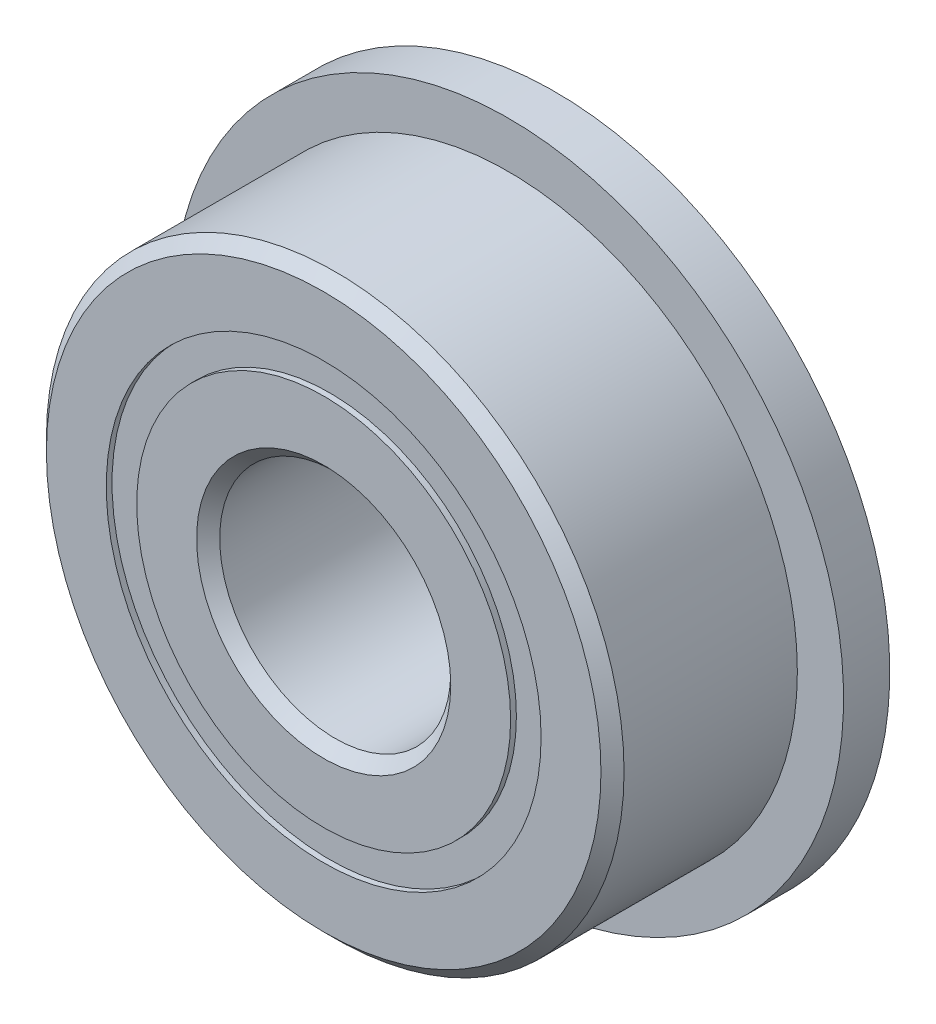
ISO-10303-21;
HEADER;
FILE_DESCRIPTION(('STEP AP214'),'2;1');
FILE_NAME('part.step','',(''),(''),'','','');
FILE_SCHEMA(('AUTOMOTIVE_DESIGN { 1 0 10303 214 1 1 1 1 }'));
ENDSEC;
DATA;
#1=APPLICATION_CONTEXT('core data for automotive mechanical design processes');
#2=APPLICATION_PROTOCOL_DEFINITION('international standard','automotive_design',2000,#1);
#3=PRODUCT_CONTEXT('',#1,'mechanical');
#4=PRODUCT('Part','Part','',(#3));
#5=PRODUCT_RELATED_PRODUCT_CATEGORY('part','',(#4));
#6=PRODUCT_DEFINITION_FORMATION('','',#4);
#7=PRODUCT_DEFINITION_CONTEXT('part definition',#1,'design');
#8=PRODUCT_DEFINITION('design','',#6,#7);
#9=PRODUCT_DEFINITION_SHAPE('','',#8);
#10=(LENGTH_UNIT() NAMED_UNIT(*) SI_UNIT(.MILLI.,.METRE.));
#11=(NAMED_UNIT(*) PLANE_ANGLE_UNIT() SI_UNIT($,.RADIAN.));
#12=(NAMED_UNIT(*) SI_UNIT($,.STERADIAN.) SOLID_ANGLE_UNIT());
#13=UNCERTAINTY_MEASURE_WITH_UNIT(LENGTH_MEASURE(1.E-05),#10,'distance_accuracy_value','');
#14=(GEOMETRIC_REPRESENTATION_CONTEXT(3) GLOBAL_UNCERTAINTY_ASSIGNED_CONTEXT((#13)) GLOBAL_UNIT_ASSIGNED_CONTEXT((#10,
#11,#12)) REPRESENTATION_CONTEXT('',''));
#15=CARTESIAN_POINT('',(0.,0.,0.));
#16=DIRECTION('',(0.,0.,1.));
#17=DIRECTION('',(1.,0.,0.));
#18=AXIS2_PLACEMENT_3D('',#15,#16,#17);
#19=CARTESIAN_POINT('',(0.,3.76373626373626,-1.9));
#20=DIRECTION('',(0.,0.,1.));
#21=DIRECTION('',(1.,0.,0.));
#22=AXIS2_PLACEMENT_3D('',#19,#20,#21);
#23=PLANE('',#22);
#24=CARTESIAN_POINT('',(0.,0.,-1.9));
#25=DIRECTION('',(0.,0.,1.));
#26=DIRECTION('',(1.,0.,0.));
#27=AXIS2_PLACEMENT_3D('',#24,#25,#26);
#28=CIRCLE('',#27,3.76373626373626);
#29=CARTESIAN_POINT('',(3.76373626373626,0.,-1.9));
#30=VERTEX_POINT('',#29);
#31=EDGE_CURVE('E65',#30,#30,#28,.T.);
#32=ORIENTED_EDGE('',*,*,#31,.F.);
#33=EDGE_LOOP('',(#32));
#34=FACE_BOUND('',#33,.T.);
#35=CARTESIAN_POINT('',(0.,0.,-1.9));
#36=DIRECTION('',(0.,0.,1.));
#37=DIRECTION('',(1.,0.,0.));
#38=AXIS2_PLACEMENT_3D('',#35,#36,#37);
#39=CIRCLE('',#38,3.23626373626373);
#40=CARTESIAN_POINT('',(3.23626373626373,0.,-1.9));
#41=VERTEX_POINT('',#40);
#42=EDGE_CURVE('E13',#41,#41,#39,.T.);
#43=ORIENTED_EDGE('',*,*,#42,.T.);
#44=EDGE_LOOP('',(#43));
#45=FACE_BOUND('',#44,.T.);
#46=ADVANCED_FACE('F51',(#34,#45),#23,.F.);
#47=CARTESIAN_POINT('',(0.,0.,2.));
#48=DIRECTION('',(0.,0.,1.));
#49=DIRECTION('',(1.,0.,0.));
#50=AXIS2_PLACEMENT_3D('',#47,#48,#49);
#51=CYLINDRICAL_SURFACE('',#50,3.23626373626374);
#52=ORIENTED_EDGE('',*,*,#42,.F.);
#53=EDGE_LOOP('',(#52));
#54=FACE_BOUND('',#53,.T.);
#55=CARTESIAN_POINT('',(0.,0.,-0.927189448602436));
#56=DIRECTION('',(0.,0.,1.));
#57=DIRECTION('',(1.,0.,0.));
#58=AXIS2_PLACEMENT_3D('',#55,#56,#57);
#59=CIRCLE('',#58,3.23626373626374);
#60=CARTESIAN_POINT('',(3.23626373626374,0.,-0.927189448602436));
#61=VERTEX_POINT('',#60);
#62=EDGE_CURVE('E57',#61,#61,#59,.T.);
#63=ORIENTED_EDGE('',*,*,#62,.T.);
#64=EDGE_LOOP('',(#63));
#65=FACE_BOUND('',#64,.T.);
#66=ADVANCED_FACE('F74',(#54,#65),#51,.F.);
#67=CARTESIAN_POINT('',(0.,3.76373626373626,-0.927189448602435));
#68=DIRECTION('',(0.,0.,-1.));
#69=DIRECTION('',(-1.,0.,0.));
#70=AXIS2_PLACEMENT_3D('',#67,#68,#69);
#71=PLANE('',#70);
#72=ORIENTED_EDGE('',*,*,#62,.F.);
#73=EDGE_LOOP('',(#72));
#74=FACE_BOUND('',#73,.T.);
#75=CARTESIAN_POINT('',(0.,0.,-0.927189448602436));
#76=DIRECTION('',(0.,0.,1.));
#77=DIRECTION('',(1.,0.,0.));
#78=AXIS2_PLACEMENT_3D('',#75,#76,#77);
#79=CIRCLE('',#78,3.76373626373626);
#80=CARTESIAN_POINT('',(3.76373626373626,0.,-0.927189448602436));
#81=VERTEX_POINT('',#80);
#82=EDGE_CURVE('E61',#81,#81,#79,.T.);
#83=ORIENTED_EDGE('',*,*,#82,.T.);
#84=EDGE_LOOP('',(#83));
#85=FACE_BOUND('',#84,.T.);
#86=ADVANCED_FACE('F78',(#74,#85),#71,.F.);
#87=CARTESIAN_POINT('',(0.,0.,2.));
#88=DIRECTION('',(0.,0.,1.));
#89=DIRECTION('',(1.,0.,0.));
#90=AXIS2_PLACEMENT_3D('',#87,#88,#89);
#91=CYLINDRICAL_SURFACE('',#90,3.76373626373626);
#92=ORIENTED_EDGE('',*,*,#82,.F.);
#93=EDGE_LOOP('',(#92));
#94=FACE_BOUND('',#93,.T.);
#95=ORIENTED_EDGE('',*,*,#31,.T.);
#96=EDGE_LOOP('',(#95));
#97=FACE_BOUND('',#96,.T.);
#98=ADVANCED_FACE('F71',(#94,#97),#91,.T.);
#99=CLOSED_SHELL('',(#46,#66,#86,#98));
#100=MANIFOLD_SOLID_BREP('B2',#99);
#101=CARTESIAN_POINT('',(0.,3.76373626373626,1.9));
#102=DIRECTION('',(0.,0.,-1.));
#103=DIRECTION('',(-1.,0.,0.));
#104=AXIS2_PLACEMENT_3D('',#101,#102,#103);
#105=PLANE('',#104);
#106=CARTESIAN_POINT('',(0.,0.,1.9));
#107=DIRECTION('',(0.,0.,1.));
#108=DIRECTION('',(1.,0.,0.));
#109=AXIS2_PLACEMENT_3D('',#106,#107,#108);
#110=CIRCLE('',#109,3.23626373626374);
#111=CARTESIAN_POINT('',(3.23626373626374,0.,1.9));
#112=VERTEX_POINT('',#111);
#113=EDGE_CURVE('E50',#112,#112,#110,.T.);
#114=ORIENTED_EDGE('',*,*,#113,.F.);
#115=EDGE_LOOP('',(#114));
#116=FACE_BOUND('',#115,.T.);
#117=CARTESIAN_POINT('',(0.,0.,1.9));
#118=DIRECTION('',(0.,0.,1.));
#119=DIRECTION('',(1.,0.,0.));
#120=AXIS2_PLACEMENT_3D('',#117,#118,#119);
#121=CIRCLE('',#120,3.76373626373626);
#122=CARTESIAN_POINT('',(3.76373626373626,0.,1.9));
#123=VERTEX_POINT('',#122);
#124=EDGE_CURVE('E139',#123,#123,#121,.T.);
#125=ORIENTED_EDGE('',*,*,#124,.T.);
#126=EDGE_LOOP('',(#125));
#127=FACE_BOUND('',#126,.T.);
#128=ADVANCED_FACE('F125',(#116,#127),#105,.F.);
#129=CARTESIAN_POINT('',(0.,0.,2.));
#130=DIRECTION('',(0.,0.,1.));
#131=DIRECTION('',(1.,0.,0.));
#132=AXIS2_PLACEMENT_3D('',#129,#130,#131);
#133=CYLINDRICAL_SURFACE('',#132,3.23626373626374);
#134=CARTESIAN_POINT('',(0.,0.,0.927189448602434));
#135=DIRECTION('',(0.,0.,1.));
#136=DIRECTION('',(1.,0.,0.));
#137=AXIS2_PLACEMENT_3D('',#134,#135,#136);
#138=CIRCLE('',#137,3.23626373626374);
#139=CARTESIAN_POINT('',(3.23626373626374,0.,0.927189448602434));
#140=VERTEX_POINT('',#139);
#141=EDGE_CURVE('E131',#140,#140,#138,.T.);
#142=ORIENTED_EDGE('',*,*,#141,.F.);
#143=EDGE_LOOP('',(#142));
#144=FACE_BOUND('',#143,.T.);
#145=ORIENTED_EDGE('',*,*,#113,.T.);
#146=EDGE_LOOP('',(#145));
#147=FACE_BOUND('',#146,.T.);
#148=ADVANCED_FACE('F154',(#144,#147),#133,.F.);
#149=CARTESIAN_POINT('',(0.,3.76373626373626,0.927189448602434));
#150=DIRECTION('',(0.,0.,1.));
#151=DIRECTION('',(1.,0.,0.));
#152=AXIS2_PLACEMENT_3D('',#149,#150,#151);
#153=PLANE('',#152);
#154=CARTESIAN_POINT('',(0.,0.,0.927189448602434));
#155=DIRECTION('',(0.,0.,1.));
#156=DIRECTION('',(1.,0.,0.));
#157=AXIS2_PLACEMENT_3D('',#154,#155,#156);
#158=CIRCLE('',#157,3.76373626373626);
#159=CARTESIAN_POINT('',(3.76373626373626,0.,0.927189448602434));
#160=VERTEX_POINT('',#159);
#161=EDGE_CURVE('E135',#160,#160,#158,.T.);
#162=ORIENTED_EDGE('',*,*,#161,.F.);
#163=EDGE_LOOP('',(#162));
#164=FACE_BOUND('',#163,.T.);
#165=ORIENTED_EDGE('',*,*,#141,.T.);
#166=EDGE_LOOP('',(#165));
#167=FACE_BOUND('',#166,.T.);
#168=ADVANCED_FACE('F149',(#164,#167),#153,.F.);
#169=CARTESIAN_POINT('',(0.,0.,2.));
#170=DIRECTION('',(0.,0.,1.));
#171=DIRECTION('',(1.,0.,0.));
#172=AXIS2_PLACEMENT_3D('',#169,#170,#171);
#173=CYLINDRICAL_SURFACE('',#172,3.76373626373626);
#174=ORIENTED_EDGE('',*,*,#124,.F.);
#175=EDGE_LOOP('',(#174));
#176=FACE_BOUND('',#175,.T.);
#177=ORIENTED_EDGE('',*,*,#161,.T.);
#178=EDGE_LOOP('',(#177));
#179=FACE_BOUND('',#178,.T.);
#180=ADVANCED_FACE('F146',(#176,#179),#173,.T.);
#181=CLOSED_SHELL('',(#128,#148,#168,#180));
#182=MANIFOLD_SOLID_BREP('B8',#181);
#183=CARTESIAN_POINT('',(-1.74999999999996,3.03108891324556,0.));
#184=DIRECTION('',(0.,0.,1.));
#185=DIRECTION('',(-0.499999999999989,0.866025403784445,0.));
#186=AXIS2_PLACEMENT_3D('',#183,#184,#185);
#187=SPHERICAL_SURFACE('',#186,0.927189448602435);
#188=CARTESIAN_POINT('',(-1.74999999999996,3.03108891324556,0.927189448602434));
#189=VERTEX_POINT('',#188);
#190=VERTEX_LOOP('',#189);
#191=FACE_BOUND('',#190,.T.);
#192=ADVANCED_FACE('F196',(#191),#187,.T.);
#193=CLOSED_SHELL('',(#192));
#194=MANIFOLD_SOLID_BREP('B45',#193);
#195=CARTESIAN_POINT('',(-3.03108891324552,1.75000000000004,0.));
#196=DIRECTION('',(0.,0.,1.));
#197=DIRECTION('',(-0.866025403784433,0.50000000000001,0.));
#198=AXIS2_PLACEMENT_3D('',#195,#196,#197);
#199=SPHERICAL_SURFACE('',#198,0.927189448602435);
#200=CARTESIAN_POINT('',(-3.03108891324552,1.75000000000004,0.927189448602434));
#201=VERTEX_POINT('',#200);
#202=VERTEX_LOOP('',#201);
#203=FACE_BOUND('',#202,.T.);
#204=ADVANCED_FACE('F218',(#203),#199,.T.);
#205=CLOSED_SHELL('',(#204));
#206=MANIFOLD_SOLID_BREP('B121',#205);
#207=CARTESIAN_POINT('',(-3.5,0.,0.));
#208=DIRECTION('',(0.,0.,1.));
#209=DIRECTION('',(-1.,0.,0.));
#210=AXIS2_PLACEMENT_3D('',#207,#208,#209);
#211=SPHERICAL_SURFACE('',#210,0.927189448602435);
#212=CARTESIAN_POINT('',(-3.5,0.,0.927189448602434));
#213=VERTEX_POINT('',#212);
#214=VERTEX_LOOP('',#213);
#215=FACE_BOUND('',#214,.T.);
#216=ADVANCED_FACE('F240',(#215),#211,.T.);
#217=CLOSED_SHELL('',(#216));
#218=MANIFOLD_SOLID_BREP('B192',#217);
#219=CARTESIAN_POINT('',(-3.03108891324555,-1.74999999999997,0.));
#220=DIRECTION('',(0.,0.,1.));
#221=DIRECTION('',(-0.866025403784443,-0.499999999999992,0.));
#222=AXIS2_PLACEMENT_3D('',#219,#220,#221);
#223=SPHERICAL_SURFACE('',#222,0.927189448602435);
#224=CARTESIAN_POINT('',(-3.03108891324555,-1.74999999999997,0.927189448602434));
#225=VERTEX_POINT('',#224);
#226=VERTEX_LOOP('',#225);
#227=FACE_BOUND('',#226,.T.);
#228=ADVANCED_FACE('F262',(#227),#223,.T.);
#229=CLOSED_SHELL('',(#228));
#230=MANIFOLD_SOLID_BREP('B214',#229);
#231=CARTESIAN_POINT('',(-1.75000000000003,-3.03108891324552,0.));
#232=DIRECTION('',(0.,0.,1.));
#233=DIRECTION('',(-0.500000000000007,-0.866025403784435,0.));
#234=AXIS2_PLACEMENT_3D('',#231,#232,#233);
#235=SPHERICAL_SURFACE('',#234,0.927189448602435);
#236=CARTESIAN_POINT('',(-1.75000000000003,-3.03108891324552,0.927189448602434));
#237=VERTEX_POINT('',#236);
#238=VERTEX_LOOP('',#237);
#239=FACE_BOUND('',#238,.T.);
#240=ADVANCED_FACE('F283',(#239),#235,.T.);
#241=CLOSED_SHELL('',(#240));
#242=MANIFOLD_SOLID_BREP('B236',#241);
#243=CARTESIAN_POINT('',(0.,-3.5,0.));
#244=DIRECTION('',(0.,0.,1.));
#245=DIRECTION('',(0.,-1.,0.));
#246=AXIS2_PLACEMENT_3D('',#243,#244,#245);
#247=SPHERICAL_SURFACE('',#246,0.927189448602435);
#248=CARTESIAN_POINT('',(0.,-3.5,0.927189448602434));
#249=VERTEX_POINT('',#248);
#250=VERTEX_LOOP('',#249);
#251=FACE_BOUND('',#250,.T.);
#252=ADVANCED_FACE('F302',(#251),#247,.T.);
#253=CLOSED_SHELL('',(#252));
#254=MANIFOLD_SOLID_BREP('B258',#253);
#255=CARTESIAN_POINT('',(1.74999999999998,-3.03108891324555,0.));
#256=DIRECTION('',(0.,0.,1.));
#257=DIRECTION('',(0.499999999999995,-0.866025403784442,0.));
#258=AXIS2_PLACEMENT_3D('',#255,#256,#257);
#259=SPHERICAL_SURFACE('',#258,0.927189448602435);
#260=CARTESIAN_POINT('',(1.74999999999998,-3.03108891324555,0.927189448602434));
#261=VERTEX_POINT('',#260);
#262=VERTEX_LOOP('',#261);
#263=FACE_BOUND('',#262,.T.);
#264=ADVANCED_FACE('F324',(#263),#259,.T.);
#265=CLOSED_SHELL('',(#264));
#266=MANIFOLD_SOLID_BREP('B279',#265);
#267=CARTESIAN_POINT('',(3.03108891324553,-1.75000000000001,0.));
#268=DIRECTION('',(0.,0.,1.));
#269=DIRECTION('',(0.866025403784436,-0.500000000000004,0.));
#270=AXIS2_PLACEMENT_3D('',#267,#268,#269);
#271=SPHERICAL_SURFACE('',#270,0.927189448602435);
#272=CARTESIAN_POINT('',(3.03108891324553,-1.75000000000001,0.927189448602434));
#273=VERTEX_POINT('',#272);
#274=VERTEX_LOOP('',#273);
#275=FACE_BOUND('',#274,.T.);
#276=ADVANCED_FACE('F346',(#275),#271,.T.);
#277=CLOSED_SHELL('',(#276));
#278=MANIFOLD_SOLID_BREP('B298',#277);
#279=CARTESIAN_POINT('',(3.5,0.,0.));
#280=DIRECTION('',(0.,0.,1.));
#281=DIRECTION('',(1.,0.,0.));
#282=AXIS2_PLACEMENT_3D('',#279,#280,#281);
#283=SPHERICAL_SURFACE('',#282,0.927189448602435);
#284=CARTESIAN_POINT('',(3.5,0.,0.927189448602434));
#285=VERTEX_POINT('',#284);
#286=VERTEX_LOOP('',#285);
#287=FACE_BOUND('',#286,.T.);
#288=ADVANCED_FACE('F368',(#287),#283,.T.);
#289=CLOSED_SHELL('',(#288));
#290=MANIFOLD_SOLID_BREP('B320',#289);
#291=CARTESIAN_POINT('',(3.03108891324554,1.74999999999999,0.));
#292=DIRECTION('',(0.,0.,1.));
#293=DIRECTION('',(0.86602540378444,0.499999999999998,0.));
#294=AXIS2_PLACEMENT_3D('',#291,#292,#293);
#295=SPHERICAL_SURFACE('',#294,0.927189448602435);
#296=CARTESIAN_POINT('',(3.03108891324554,1.74999999999999,0.927189448602434));
#297=VERTEX_POINT('',#296);
#298=VERTEX_LOOP('',#297);
#299=FACE_BOUND('',#298,.T.);
#300=ADVANCED_FACE('F390',(#299),#295,.T.);
#301=CLOSED_SHELL('',(#300));
#302=MANIFOLD_SOLID_BREP('B342',#301);
#303=CARTESIAN_POINT('',(1.75,3.03108891324553,0.));
#304=DIRECTION('',(0.,0.,1.));
#305=DIRECTION('',(0.500000000000001,0.866025403784438,0.));
#306=AXIS2_PLACEMENT_3D('',#303,#304,#305);
#307=SPHERICAL_SURFACE('',#306,0.927189448602435);
#308=CARTESIAN_POINT('',(1.75,3.03108891324553,0.927189448602434));
#309=VERTEX_POINT('',#308);
#310=VERTEX_LOOP('',#309);
#311=FACE_BOUND('',#310,.T.);
#312=ADVANCED_FACE('F411',(#311),#307,.T.);
#313=CLOSED_SHELL('',(#312));
#314=MANIFOLD_SOLID_BREP('B364',#313);
#315=CARTESIAN_POINT('',(0.,3.5,0.));
#316=DIRECTION('',(0.,0.,1.));
#317=DIRECTION('',(0.,1.,0.));
#318=AXIS2_PLACEMENT_3D('',#315,#316,#317);
#319=SPHERICAL_SURFACE('',#318,0.927189448602435);
#320=CARTESIAN_POINT('',(0.,3.5,0.927189448602434));
#321=VERTEX_POINT('',#320);
#322=VERTEX_LOOP('',#321);
#323=FACE_BOUND('',#322,.T.);
#324=ADVANCED_FACE('F433',(#323),#319,.T.);
#325=CLOSED_SHELL('',(#324));
#326=MANIFOLD_SOLID_BREP('B386',#325);
#327=CARTESIAN_POINT('',(0.,3.23626373626374,2.));
#328=DIRECTION('',(0.,0.,-1.));
#329=DIRECTION('',(-1.,0.,0.));
#330=AXIS2_PLACEMENT_3D('',#327,#328,#329);
#331=PLANE('',#330);
#332=CARTESIAN_POINT('',(0.,0.,2.));
#333=DIRECTION('',(0.,0.,1.));
#334=DIRECTION('',(1.,0.,0.));
#335=AXIS2_PLACEMENT_3D('',#332,#333,#334);
#336=CIRCLE('',#335,2.2);
#337=CARTESIAN_POINT('',(2.2,0.,2.));
#338=VERTEX_POINT('',#337);
#339=EDGE_CURVE('E488',#338,#338,#336,.T.);
#340=ORIENTED_EDGE('',*,*,#339,.F.);
#341=EDGE_LOOP('',(#340));
#342=FACE_BOUND('',#341,.T.);
#343=CARTESIAN_POINT('',(0.,0.,2.));
#344=DIRECTION('',(0.,0.,1.));
#345=DIRECTION('',(1.,0.,0.));
#346=AXIS2_PLACEMENT_3D('',#343,#344,#345);
#347=CIRCLE('',#346,3.23626373626374);
#348=CARTESIAN_POINT('',(3.23626373626374,0.,2.));
#349=VERTEX_POINT('',#348);
#350=EDGE_CURVE('E432',#349,#349,#347,.T.);
#351=ORIENTED_EDGE('',*,*,#350,.T.);
#352=EDGE_LOOP('',(#351));
#353=FACE_BOUND('',#352,.T.);
#354=ADVANCED_FACE('F460',(#342,#353),#331,.F.);
#355=CARTESIAN_POINT('',(0.,0.,2.));
#356=DIRECTION('',(0.,0.,1.));
#357=DIRECTION('',(1.,0.,0.));
#358=AXIS2_PLACEMENT_3D('',#355,#356,#357);
#359=CYLINDRICAL_SURFACE('',#358,3.23626373626374);
#360=ORIENTED_EDGE('',*,*,#350,.F.);
#361=EDGE_LOOP('',(#360));
#362=FACE_BOUND('',#361,.T.);
#363=CARTESIAN_POINT('',(0.,0.,0.888888888888888));
#364=DIRECTION('',(0.,0.,1.));
#365=DIRECTION('',(1.,0.,0.));
#366=AXIS2_PLACEMENT_3D('',#363,#364,#365);
#367=CIRCLE('',#366,3.23626373626374);
#368=CARTESIAN_POINT('',(3.23626373626374,0.,0.888888888888888));
#369=VERTEX_POINT('',#368);
#370=EDGE_CURVE('E466',#369,#369,#367,.T.);
#371=ORIENTED_EDGE('',*,*,#370,.T.);
#372=EDGE_LOOP('',(#371));
#373=FACE_BOUND('',#372,.T.);
#374=ADVANCED_FACE('F495',(#362,#373),#359,.T.);
#375=CARTESIAN_POINT('',(0.,0.,0.));
#376=DIRECTION('',(0.,0.,1.));
#377=DIRECTION('',(1.,0.,0.));
#378=AXIS2_PLACEMENT_3D('',#375,#376,#377);
#379=TOROIDAL_SURFACE('',#378,3.49999999999999,0.927189448602433);
#380=ORIENTED_EDGE('',*,*,#370,.F.);
#381=EDGE_LOOP('',(#380));
#382=FACE_BOUND('',#381,.T.);
#383=CARTESIAN_POINT('',(0.,0.,-0.88888888888889));
#384=DIRECTION('',(0.,0.,1.));
#385=DIRECTION('',(1.,0.,0.));
#386=AXIS2_PLACEMENT_3D('',#383,#384,#385);
#387=CIRCLE('',#386,3.23626373626373);
#388=CARTESIAN_POINT('',(3.23626373626373,0.,-0.88888888888889));
#389=VERTEX_POINT('',#388);
#390=EDGE_CURVE('E470',#389,#389,#387,.T.);
#391=ORIENTED_EDGE('',*,*,#390,.T.);
#392=EDGE_LOOP('',(#391));
#393=FACE_BOUND('',#392,.T.);
#394=ADVANCED_FACE('F499',(#382,#393),#379,.F.);
#395=CARTESIAN_POINT('',(0.,0.,2.));
#396=DIRECTION('',(0.,0.,1.));
#397=DIRECTION('',(1.,0.,0.));
#398=AXIS2_PLACEMENT_3D('',#395,#396,#397);
#399=CYLINDRICAL_SURFACE('',#398,3.23626373626374);
#400=ORIENTED_EDGE('',*,*,#390,.F.);
#401=EDGE_LOOP('',(#400));
#402=FACE_BOUND('',#401,.T.);
#403=CARTESIAN_POINT('',(0.,0.,-2.));
#404=DIRECTION('',(0.,0.,1.));
#405=DIRECTION('',(1.,0.,0.));
#406=AXIS2_PLACEMENT_3D('',#403,#404,#405);
#407=CIRCLE('',#406,3.23626373626374);
#408=CARTESIAN_POINT('',(3.23626373626374,0.,-2.));
#409=VERTEX_POINT('',#408);
#410=EDGE_CURVE('E474',#409,#409,#407,.T.);
#411=ORIENTED_EDGE('',*,*,#410,.T.);
#412=EDGE_LOOP('',(#411));
#413=FACE_BOUND('',#412,.T.);
#414=ADVANCED_FACE('F504',(#402,#413),#399,.T.);
#415=CARTESIAN_POINT('',(0.,2.2,-2.));
#416=DIRECTION('',(0.,0.,1.));
#417=DIRECTION('',(1.,0.,0.));
#418=AXIS2_PLACEMENT_3D('',#415,#416,#417);
#419=PLANE('',#418);
#420=ORIENTED_EDGE('',*,*,#410,.F.);
#421=EDGE_LOOP('',(#420));
#422=FACE_BOUND('',#421,.T.);
#423=CARTESIAN_POINT('',(0.,0.,-2.));
#424=DIRECTION('',(0.,0.,1.));
#425=DIRECTION('',(1.,0.,0.));
#426=AXIS2_PLACEMENT_3D('',#423,#424,#425);
#427=CIRCLE('',#426,2.2);
#428=CARTESIAN_POINT('',(2.2,0.,-2.));
#429=VERTEX_POINT('',#428);
#430=EDGE_CURVE('E479',#429,#429,#427,.T.);
#431=ORIENTED_EDGE('',*,*,#430,.T.);
#432=EDGE_LOOP('',(#431));
#433=FACE_BOUND('',#432,.T.);
#434=ADVANCED_FACE('F510',(#422,#433),#419,.F.);
#435=CARTESIAN_POINT('',(0.,0.,-1.8));
#436=DIRECTION('',(0.,0.,-1.));
#437=DIRECTION('',(-1.,0.,0.));
#438=AXIS2_PLACEMENT_3D('',#435,#436,#437);
#439=CONICAL_SURFACE('',#438,2.,0.785398163397448);
#440=ORIENTED_EDGE('',*,*,#430,.F.);
#441=EDGE_LOOP('',(#440));
#442=FACE_BOUND('',#441,.T.);
#443=CARTESIAN_POINT('',(0.,0.,-1.8));
#444=DIRECTION('',(0.,0.,1.));
#445=DIRECTION('',(1.,0.,0.));
#446=AXIS2_PLACEMENT_3D('',#443,#444,#445);
#447=CIRCLE('',#446,2.);
#448=CARTESIAN_POINT('',(2.,0.,-1.8));
#449=VERTEX_POINT('',#448);
#450=EDGE_CURVE('E482',#449,#449,#447,.T.);
#451=ORIENTED_EDGE('',*,*,#450,.T.);
#452=EDGE_LOOP('',(#451));
#453=FACE_BOUND('',#452,.T.);
#454=ADVANCED_FACE('F514',(#442,#453),#439,.F.);
#455=CARTESIAN_POINT('',(0.,0.,2.));
#456=DIRECTION('',(0.,0.,1.));
#457=DIRECTION('',(1.,0.,0.));
#458=AXIS2_PLACEMENT_3D('',#455,#456,#457);
#459=CYLINDRICAL_SURFACE('',#458,2.);
#460=ORIENTED_EDGE('',*,*,#450,.F.);
#461=EDGE_LOOP('',(#460));
#462=FACE_BOUND('',#461,.T.);
#463=CARTESIAN_POINT('',(0.,0.,1.8));
#464=DIRECTION('',(0.,0.,1.));
#465=DIRECTION('',(1.,0.,0.));
#466=AXIS2_PLACEMENT_3D('',#463,#464,#465);
#467=CIRCLE('',#466,2.);
#468=CARTESIAN_POINT('',(2.,0.,1.8));
#469=VERTEX_POINT('',#468);
#470=EDGE_CURVE('E485',#469,#469,#467,.T.);
#471=ORIENTED_EDGE('',*,*,#470,.T.);
#472=EDGE_LOOP('',(#471));
#473=FACE_BOUND('',#472,.T.);
#474=ADVANCED_FACE('F518',(#462,#473),#459,.F.);
#475=CARTESIAN_POINT('',(0.,0.,2.));
#476=DIRECTION('',(0.,0.,1.));
#477=DIRECTION('',(1.,0.,0.));
#478=AXIS2_PLACEMENT_3D('',#475,#476,#477);
#479=CONICAL_SURFACE('',#478,2.2,0.785398163397449);
#480=ORIENTED_EDGE('',*,*,#470,.F.);
#481=EDGE_LOOP('',(#480));
#482=FACE_BOUND('',#481,.T.);
#483=ORIENTED_EDGE('',*,*,#339,.T.);
#484=EDGE_LOOP('',(#483));
#485=FACE_BOUND('',#484,.T.);
#486=ADVANCED_FACE('F492',(#482,#485),#479,.F.);
#487=CLOSED_SHELL('',(#354,#374,#394,#414,#434,#454,#474,#486));
#488=MANIFOLD_SOLID_BREP('B407',#487);
#489=CARTESIAN_POINT('',(0.,0.,1.8));
#490=DIRECTION('',(0.,0.,-1.));
#491=DIRECTION('',(-1.,0.,0.));
#492=AXIS2_PLACEMENT_3D('',#489,#490,#491);
#493=CONICAL_SURFACE('',#492,5.,0.785398163397449);
#494=CARTESIAN_POINT('',(0.,0.,2.));
#495=DIRECTION('',(0.,0.,1.));
#496=DIRECTION('',(1.,0.,0.));
#497=AXIS2_PLACEMENT_3D('',#494,#495,#496);
#498=CIRCLE('',#497,4.8);
#499=CARTESIAN_POINT('',(4.8,0.,2.));
#500=VERTEX_POINT('',#499);
#501=EDGE_CURVE('E609',#500,#500,#498,.T.);
#502=ORIENTED_EDGE('',*,*,#501,.F.);
#503=EDGE_LOOP('',(#502));
#504=FACE_BOUND('',#503,.T.);
#505=CARTESIAN_POINT('',(0.,0.,1.8));
#506=DIRECTION('',(0.,0.,1.));
#507=DIRECTION('',(1.,0.,0.));
#508=AXIS2_PLACEMENT_3D('',#505,#506,#507);
#509=CIRCLE('',#508,5.);
#510=CARTESIAN_POINT('',(5.,0.,1.8));
#511=VERTEX_POINT('',#510);
#512=EDGE_CURVE('E459',#511,#511,#509,.T.);
#513=ORIENTED_EDGE('',*,*,#512,.T.);
#514=EDGE_LOOP('',(#513));
#515=FACE_BOUND('',#514,.T.);
#516=ADVANCED_FACE('F587',(#504,#515),#493,.T.);
#517=CARTESIAN_POINT('',(0.,0.,2.));
#518=DIRECTION('',(0.,0.,1.));
#519=DIRECTION('',(1.,0.,0.));
#520=AXIS2_PLACEMENT_3D('',#517,#518,#519);
#521=CYLINDRICAL_SURFACE('',#520,5.);
#522=CARTESIAN_POINT('',(0.,0.,-1.2));
#523=DIRECTION('',(0.,0.,1.));
#524=DIRECTION('',(1.,0.,0.));
#525=AXIS2_PLACEMENT_3D('',#522,#523,#524);
#526=CIRCLE('',#525,5.);
#527=CARTESIAN_POINT('',(5.,0.,-1.2));
#528=VERTEX_POINT('',#527);
#529=EDGE_CURVE('E612',#528,#528,#526,.T.);
#530=ORIENTED_EDGE('',*,*,#529,.T.);
#531=EDGE_LOOP('',(#530));
#532=FACE_BOUND('',#531,.T.);
#533=ORIENTED_EDGE('',*,*,#512,.F.);
#534=EDGE_LOOP('',(#533));
#535=FACE_BOUND('',#534,.T.);
#536=ADVANCED_FACE('F632',(#532,#535),#521,.T.);
#537=CARTESIAN_POINT('',(0.,4.8,-2.));
#538=DIRECTION('',(0.,0.,1.));
#539=DIRECTION('',(1.,0.,0.));
#540=AXIS2_PLACEMENT_3D('',#537,#538,#539);
#541=PLANE('',#540);
#542=CARTESIAN_POINT('',(0.,0.,-2.));
#543=DIRECTION('',(0.,0.,1.));
#544=DIRECTION('',(1.,0.,0.));
#545=AXIS2_PLACEMENT_3D('',#542,#543,#544);
#546=CIRCLE('',#545,3.76373626373626);
#547=CARTESIAN_POINT('',(3.76373626373626,0.,-2.));
#548=VERTEX_POINT('',#547);
#549=EDGE_CURVE('E593',#548,#548,#546,.T.);
#550=ORIENTED_EDGE('',*,*,#549,.T.);
#551=EDGE_LOOP('',(#550));
#552=FACE_BOUND('',#551,.T.);
#553=CARTESIAN_POINT('',(0.,0.,-2.));
#554=DIRECTION('',(0.,0.,-1.));
#555=DIRECTION('',(-1.,0.,0.));
#556=AXIS2_PLACEMENT_3D('',#553,#554,#555);
#557=CIRCLE('',#556,5.8);
#558=CARTESIAN_POINT('',(-5.8,0.,-2.));
#559=VERTEX_POINT('',#558);
#560=EDGE_CURVE('E615',#559,#559,#557,.T.);
#561=ORIENTED_EDGE('',*,*,#560,.T.);
#562=EDGE_LOOP('',(#561));
#563=FACE_BOUND('',#562,.T.);
#564=ADVANCED_FACE('F635',(#552,#563),#541,.F.);
#565=CARTESIAN_POINT('',(0.,0.,2.));
#566=DIRECTION('',(0.,0.,1.));
#567=DIRECTION('',(1.,0.,0.));
#568=AXIS2_PLACEMENT_3D('',#565,#566,#567);
#569=CYLINDRICAL_SURFACE('',#568,3.76373626373626);
#570=CARTESIAN_POINT('',(0.,0.,-0.88888888888889));
#571=DIRECTION('',(0.,0.,1.));
#572=DIRECTION('',(1.,0.,0.));
#573=AXIS2_PLACEMENT_3D('',#570,#571,#572);
#574=CIRCLE('',#573,3.76373626373626);
#575=CARTESIAN_POINT('',(3.76373626373626,0.,-0.88888888888889));
#576=VERTEX_POINT('',#575);
#577=EDGE_CURVE('E597',#576,#576,#574,.T.);
#578=ORIENTED_EDGE('',*,*,#577,.T.);
#579=EDGE_LOOP('',(#578));
#580=FACE_BOUND('',#579,.T.);
#581=ORIENTED_EDGE('',*,*,#549,.F.);
#582=EDGE_LOOP('',(#581));
#583=FACE_BOUND('',#582,.T.);
#584=ADVANCED_FACE('F640',(#580,#583),#569,.F.);
#585=CARTESIAN_POINT('',(0.,0.,0.));
#586=DIRECTION('',(0.,0.,1.));
#587=DIRECTION('',(1.,0.,0.));
#588=AXIS2_PLACEMENT_3D('',#585,#586,#587);
#589=TOROIDAL_SURFACE('',#588,3.5,0.927189448602435);
#590=ORIENTED_EDGE('',*,*,#577,.F.);
#591=EDGE_LOOP('',(#590));
#592=FACE_BOUND('',#591,.T.);
#593=CARTESIAN_POINT('',(0.,0.,0.888888888888888));
#594=DIRECTION('',(0.,0.,1.));
#595=DIRECTION('',(1.,0.,0.));
#596=AXIS2_PLACEMENT_3D('',#593,#594,#595);
#597=CIRCLE('',#596,3.76373626373626);
#598=CARTESIAN_POINT('',(3.76373626373626,0.,0.888888888888888));
#599=VERTEX_POINT('',#598);
#600=EDGE_CURVE('E601',#599,#599,#597,.T.);
#601=ORIENTED_EDGE('',*,*,#600,.T.);
#602=EDGE_LOOP('',(#601));
#603=FACE_BOUND('',#602,.T.);
#604=ADVANCED_FACE('F646',(#592,#603),#589,.F.);
#605=CARTESIAN_POINT('',(0.,0.,2.));
#606=DIRECTION('',(0.,0.,1.));
#607=DIRECTION('',(1.,0.,0.));
#608=AXIS2_PLACEMENT_3D('',#605,#606,#607);
#609=CYLINDRICAL_SURFACE('',#608,3.76373626373626);
#610=ORIENTED_EDGE('',*,*,#600,.F.);
#611=EDGE_LOOP('',(#610));
#612=FACE_BOUND('',#611,.T.);
#613=CARTESIAN_POINT('',(0.,0.,2.));
#614=DIRECTION('',(0.,0.,1.));
#615=DIRECTION('',(1.,0.,0.));
#616=AXIS2_PLACEMENT_3D('',#613,#614,#615);
#617=CIRCLE('',#616,3.76373626373626);
#618=CARTESIAN_POINT('',(3.76373626373626,0.,2.));
#619=VERTEX_POINT('',#618);
#620=EDGE_CURVE('E606',#619,#619,#617,.T.);
#621=ORIENTED_EDGE('',*,*,#620,.T.);
#622=EDGE_LOOP('',(#621));
#623=FACE_BOUND('',#622,.T.);
#624=ADVANCED_FACE('F650',(#612,#623),#609,.F.);
#625=CARTESIAN_POINT('',(0.,4.8,2.));
#626=DIRECTION('',(0.,0.,-1.));
#627=DIRECTION('',(-1.,0.,0.));
#628=AXIS2_PLACEMENT_3D('',#625,#626,#627);
#629=PLANE('',#628);
#630=ORIENTED_EDGE('',*,*,#620,.F.);
#631=EDGE_LOOP('',(#630));
#632=FACE_BOUND('',#631,.T.);
#633=ORIENTED_EDGE('',*,*,#501,.T.);
#634=EDGE_LOOP('',(#633));
#635=FACE_BOUND('',#634,.T.);
#636=ADVANCED_FACE('F628',(#632,#635),#629,.F.);
#637=CARTESIAN_POINT('',(0.,3.76373626373626,-1.2));
#638=DIRECTION('',(0.,0.,1.));
#639=DIRECTION('',(1.,0.,0.));
#640=AXIS2_PLACEMENT_3D('',#637,#638,#639);
#641=PLANE('',#640);
#642=CARTESIAN_POINT('',(0.,0.,-1.2));
#643=DIRECTION('',(0.,0.,-1.));
#644=DIRECTION('',(-1.,0.,0.));
#645=AXIS2_PLACEMENT_3D('',#642,#643,#644);
#646=CIRCLE('',#645,5.8);
#647=CARTESIAN_POINT('',(-5.8,0.,-1.2));
#648=VERTEX_POINT('',#647);
#649=EDGE_CURVE('E618',#648,#648,#646,.T.);
#650=ORIENTED_EDGE('',*,*,#649,.F.);
#651=EDGE_LOOP('',(#650));
#652=FACE_BOUND('',#651,.T.);
#653=ORIENTED_EDGE('',*,*,#529,.F.);
#654=EDGE_LOOP('',(#653));
#655=FACE_BOUND('',#654,.T.);
#656=ADVANCED_FACE('F625',(#652,#655),#641,.T.);
#657=CARTESIAN_POINT('',(0.,0.,-2.));
#658=DIRECTION('',(0.,0.,-1.));
#659=DIRECTION('',(-1.,0.,0.));
#660=AXIS2_PLACEMENT_3D('',#657,#658,#659);
#661=CYLINDRICAL_SURFACE('',#660,5.8);
#662=ORIENTED_EDGE('',*,*,#649,.T.);
#663=EDGE_LOOP('',(#662));
#664=FACE_BOUND('',#663,.T.);
#665=ORIENTED_EDGE('',*,*,#560,.F.);
#666=EDGE_LOOP('',(#665));
#667=FACE_BOUND('',#666,.T.);
#668=ADVANCED_FACE('F622',(#664,#667),#661,.T.);
#669=CLOSED_SHELL('',(#516,#536,#564,#584,#604,#624,#636,#656,#668));
#670=MANIFOLD_SOLID_BREP('B427',#669);
#671=ADVANCED_BREP_SHAPE_REPRESENTATION('',(#18,#100,#182,#194,#206,#218,#230,#242,#254,#266,
#278,#290,#302,#314,#326,#488,#670),#14);
#672=SHAPE_DEFINITION_REPRESENTATION(#9,#671);
ENDSEC;
END-ISO-10303-21;
